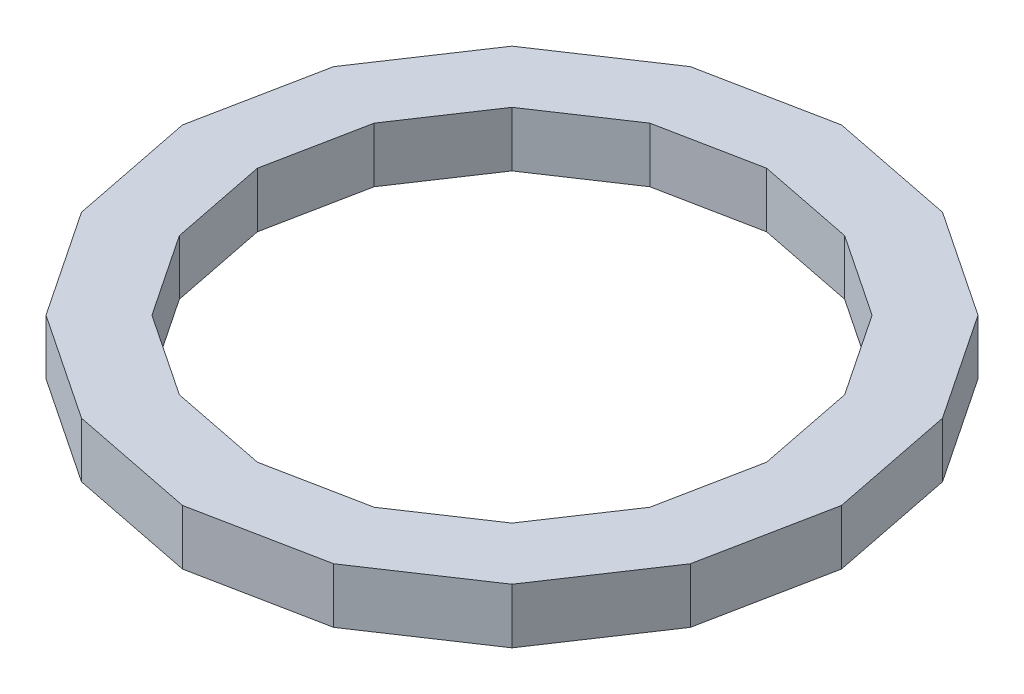
ISO-10303-21;
HEADER;
FILE_DESCRIPTION(('STEP AP214'),'2;1');
FILE_NAME('part.step','',(''),(''),'','','');
FILE_SCHEMA(('AUTOMOTIVE_DESIGN { 1 0 10303 214 1 1 1 1 }'));
ENDSEC;
DATA;
#1=APPLICATION_CONTEXT('core data for automotive mechanical design processes');
#2=APPLICATION_PROTOCOL_DEFINITION('international standard','automotive_design',2000,#1);
#3=PRODUCT_CONTEXT('',#1,'mechanical');
#4=PRODUCT('Part','Part','',(#3));
#5=PRODUCT_RELATED_PRODUCT_CATEGORY('part','',(#4));
#6=PRODUCT_DEFINITION_FORMATION('','',#4);
#7=PRODUCT_DEFINITION_CONTEXT('part definition',#1,'design');
#8=PRODUCT_DEFINITION('design','',#6,#7);
#9=PRODUCT_DEFINITION_SHAPE('','',#8);
#10=(LENGTH_UNIT() NAMED_UNIT(*) SI_UNIT(.MILLI.,.METRE.));
#11=(NAMED_UNIT(*) PLANE_ANGLE_UNIT() SI_UNIT($,.RADIAN.));
#12=(NAMED_UNIT(*) SI_UNIT($,.STERADIAN.) SOLID_ANGLE_UNIT());
#13=UNCERTAINTY_MEASURE_WITH_UNIT(LENGTH_MEASURE(1.E-05),#10,'distance_accuracy_value','');
#14=(GEOMETRIC_REPRESENTATION_CONTEXT(3) GLOBAL_UNCERTAINTY_ASSIGNED_CONTEXT((#13)) GLOBAL_UNIT_ASSIGNED_CONTEXT((#10,
#11,#12)) REPRESENTATION_CONTEXT('',''));
#15=CARTESIAN_POINT('',(0.,0.,0.));
#16=DIRECTION('',(0.,0.,1.));
#17=DIRECTION('',(1.,0.,0.));
#18=AXIS2_PLACEMENT_3D('',#15,#16,#17);
#19=CARTESIAN_POINT('',(0.,19.05,0.));
#20=DIRECTION('',(0.,1.,0.));
#21=DIRECTION('',(0.,0.,1.));
#22=AXIS2_PLACEMENT_3D('',#19,#20,#21);
#23=PLANE('',#22);
#24=DIRECTION('',(0.195090322016116,0.,-0.980785280403233));
#25=VECTOR('',#24,1.);
#26=CARTESIAN_POINT('',(105.249826838494,19.05,43.5959057139223));
#27=LINE('',#26,#25);
#28=CARTESIAN_POINT('',(105.249826838494,19.05,43.5959057139223));
#29=VERTEX_POINT('',#28);
#30=CARTESIAN_POINT('',(113.92159165211,19.05,-1.38083731866745E-12));
#31=VERTEX_POINT('',#30);
#32=EDGE_CURVE('E372',#29,#31,#27,.T.);
#33=ORIENTED_EDGE('',*,*,#32,.T.);
#34=DIRECTION('',(-0.19509032201614,0.,-0.980785280403228));
#35=VECTOR('',#34,1.);
#36=CARTESIAN_POINT('',(113.92159165211,19.05,-1.38083731866745E-12));
#37=LINE('',#36,#35);
#38=CARTESIAN_POINT('',(105.249826838493,19.05,-43.5959057139249));
#39=VERTEX_POINT('',#38);
#40=EDGE_CURVE('E375',#31,#39,#37,.T.);
#41=ORIENTED_EDGE('',*,*,#40,.T.);
#42=DIRECTION('',(-0.555570233019612,0.,-0.831469612302539));
#43=VECTOR('',#42,1.);
#44=CARTESIAN_POINT('',(105.249826838493,19.05,-43.5959057139249));
#45=LINE('',#44,#43);
#46=CARTESIAN_POINT('',(80.5547299807708,19.05,-80.5547299807727));
#47=VERTEX_POINT('',#46);
#48=EDGE_CURVE('E378',#39,#47,#45,.T.);
#49=ORIENTED_EDGE('',*,*,#48,.T.);
#50=DIRECTION('',(-0.831469612302552,0.,-0.555570233019592));
#51=VECTOR('',#50,1.);
#52=CARTESIAN_POINT('',(80.5547299807708,19.05,-80.5547299807727));
#53=LINE('',#52,#51);
#54=CARTESIAN_POINT('',(43.5959057139224,19.05,-105.249826838494));
#55=VERTEX_POINT('',#54);
#56=EDGE_CURVE('E380',#47,#55,#53,.T.);
#57=ORIENTED_EDGE('',*,*,#56,.T.);
#58=DIRECTION('',(-0.980785280403233,0.,-0.195090322016116));
#59=VECTOR('',#58,1.);
#60=CARTESIAN_POINT('',(43.5959057139224,19.05,-105.249826838494));
#61=LINE('',#60,#59);
#62=CARTESIAN_POINT('',(-1.36013104406031E-12,19.05,-113.92159165211));
#63=VERTEX_POINT('',#62);
#64=EDGE_CURVE('E382',#55,#63,#61,.T.);
#65=ORIENTED_EDGE('',*,*,#64,.T.);
#66=DIRECTION('',(-0.980785280403228,0.,0.19509032201614));
#67=VECTOR('',#66,1.);
#68=CARTESIAN_POINT('',(-1.36013104406031E-12,19.05,-113.92159165211));
#69=LINE('',#68,#67);
#70=CARTESIAN_POINT('',(-43.5959057139248,19.05,-105.249826838493));
#71=VERTEX_POINT('',#70);
#72=EDGE_CURVE('E384',#63,#71,#69,.T.);
#73=ORIENTED_EDGE('',*,*,#72,.T.);
#74=DIRECTION('',(-0.831469612302539,0.,0.555570233019612));
#75=VECTOR('',#74,1.);
#76=CARTESIAN_POINT('',(-43.5959057139248,19.05,-105.249826838493));
#77=LINE('',#76,#75);
#78=CARTESIAN_POINT('',(-80.5547299807727,19.05,-80.5547299807707));
#79=VERTEX_POINT('',#78);
#80=EDGE_CURVE('E387',#71,#79,#77,.T.);
#81=ORIENTED_EDGE('',*,*,#80,.T.);
#82=DIRECTION('',(-0.555570233019592,0.,0.831469612302552));
#83=VECTOR('',#82,1.);
#84=CARTESIAN_POINT('',(-80.5547299807727,19.05,-80.5547299807707));
#85=LINE('',#84,#83);
#86=CARTESIAN_POINT('',(-105.249826838494,19.05,-43.5959057139223));
#87=VERTEX_POINT('',#86);
#88=EDGE_CURVE('E390',#79,#87,#85,.T.);
#89=ORIENTED_EDGE('',*,*,#88,.T.);
#90=DIRECTION('',(-0.195090322016116,0.,0.980785280403233));
#91=VECTOR('',#90,1.);
#92=CARTESIAN_POINT('',(-105.249826838494,19.05,-43.5959057139223));
#93=LINE('',#92,#91);
#94=CARTESIAN_POINT('',(-113.92159165211,19.05,1.41129865460609E-12));
#95=VERTEX_POINT('',#94);
#96=EDGE_CURVE('E393',#87,#95,#93,.T.);
#97=ORIENTED_EDGE('',*,*,#96,.T.);
#98=DIRECTION('',(0.19509032201614,0.,0.980785280403228));
#99=VECTOR('',#98,1.);
#100=CARTESIAN_POINT('',(-113.92159165211,19.05,1.41129865460609E-12));
#101=LINE('',#100,#99);
#102=CARTESIAN_POINT('',(-105.249826838493,19.05,43.5959057139248));
#103=VERTEX_POINT('',#102);
#104=EDGE_CURVE('E395',#95,#103,#101,.T.);
#105=ORIENTED_EDGE('',*,*,#104,.T.);
#106=DIRECTION('',(0.555570233019612,0.,0.831469612302539));
#107=VECTOR('',#106,1.);
#108=CARTESIAN_POINT('',(-105.249826838493,19.05,43.5959057139248));
#109=LINE('',#108,#107);
#110=CARTESIAN_POINT('',(-80.5547299807708,19.05,80.5547299807727));
#111=VERTEX_POINT('',#110);
#112=EDGE_CURVE('E397',#103,#111,#109,.T.);
#113=ORIENTED_EDGE('',*,*,#112,.T.);
#114=DIRECTION('',(0.831469612302552,0.,0.555570233019592));
#115=VECTOR('',#114,1.);
#116=CARTESIAN_POINT('',(-80.5547299807708,19.05,80.5547299807727));
#117=LINE('',#116,#115);
#118=CARTESIAN_POINT('',(-43.5959057139223,19.05,105.249826838494));
#119=VERTEX_POINT('',#118);
#120=EDGE_CURVE('E400',#111,#119,#117,.T.);
#121=ORIENTED_EDGE('',*,*,#120,.T.);
#122=DIRECTION('',(0.980785280403233,0.,0.195090322016117));
#123=VECTOR('',#122,1.);
#124=CARTESIAN_POINT('',(-43.5959057139223,19.05,105.249826838494));
#125=LINE('',#124,#123);
#126=CARTESIAN_POINT('',(1.33304293934203E-12,19.05,113.92159165211));
#127=VERTEX_POINT('',#126);
#128=EDGE_CURVE('E403',#119,#127,#125,.T.);
#129=ORIENTED_EDGE('',*,*,#128,.T.);
#130=DIRECTION('',(0.980785280403228,0.,-0.19509032201614));
#131=VECTOR('',#130,1.);
#132=CARTESIAN_POINT('',(1.33304293934203E-12,19.05,113.92159165211));
#133=LINE('',#132,#131);
#134=CARTESIAN_POINT('',(43.5959057139249,19.05,105.249826838493));
#135=VERTEX_POINT('',#134);
#136=EDGE_CURVE('E405',#127,#135,#133,.T.);
#137=ORIENTED_EDGE('',*,*,#136,.T.);
#138=DIRECTION('',(0.831469612302538,0.,-0.555570233019612));
#139=VECTOR('',#138,1.);
#140=CARTESIAN_POINT('',(43.5959057139249,19.05,105.249826838493));
#141=LINE('',#140,#139);
#142=CARTESIAN_POINT('',(80.5547299807727,19.05,80.5547299807708));
#143=VERTEX_POINT('',#142);
#144=EDGE_CURVE('E408',#135,#143,#141,.T.);
#145=ORIENTED_EDGE('',*,*,#144,.T.);
#146=DIRECTION('',(0.555570233019593,0.,-0.831469612302552));
#147=VECTOR('',#146,1.);
#148=CARTESIAN_POINT('',(80.5547299807727,19.05,80.5547299807708));
#149=LINE('',#148,#147);
#150=EDGE_CURVE('E411',#143,#29,#149,.T.);
#151=ORIENTED_EDGE('',*,*,#150,.T.);
#152=EDGE_LOOP('',(#33,#41,#49,#57,#65,#73,#81,#89,#97,#105,#113,#121,#129,#137,#145,#151));
#153=FACE_BOUND('',#152,.T.);
#154=DIRECTION('',(-0.19509032201614,0.,-0.980785280403228));
#155=VECTOR('',#154,1.);
#156=CARTESIAN_POINT('',(88.0239762336187,19.05,-1.06343948983801E-12));
#157=LINE('',#156,#155);
#158=CARTESIAN_POINT('',(88.0239762336187,19.05,-1.06343948983801E-12));
#159=VERTEX_POINT('',#158);
#160=CARTESIAN_POINT('',(81.3235500124998,19.05,-33.6853173555053));
#161=VERTEX_POINT('',#160);
#162=EDGE_CURVE('E253',#159,#161,#157,.T.);
#163=ORIENTED_EDGE('',*,*,#162,.F.);
#164=DIRECTION('',(0.195090322016116,0.,-0.980785280403233));
#165=VECTOR('',#164,1.);
#166=CARTESIAN_POINT('',(81.3235500125007,19.05,33.6853173555033));
#167=LINE('',#166,#165);
#168=CARTESIAN_POINT('',(81.3235500125007,19.05,33.6853173555033));
#169=VERTEX_POINT('',#168);
#170=EDGE_CURVE('E244',#169,#159,#167,.T.);
#171=ORIENTED_EDGE('',*,*,#170,.F.);
#172=DIRECTION('',(0.555570233019592,0.,-0.831469612302552));
#173=VECTOR('',#172,1.);
#174=CARTESIAN_POINT('',(62.242350501796,19.05,62.2423505017945));
#175=LINE('',#174,#173);
#176=CARTESIAN_POINT('',(62.242350501796,19.05,62.2423505017945));
#177=VERTEX_POINT('',#176);
#178=EDGE_CURVE('E296',#177,#169,#175,.T.);
#179=ORIENTED_EDGE('',*,*,#178,.F.);
#180=DIRECTION('',(0.831469612302539,0.,-0.555570233019612));
#181=VECTOR('',#180,1.);
#182=CARTESIAN_POINT('',(33.6853173555052,19.05,81.3235500124999));
#183=LINE('',#182,#181);
#184=CARTESIAN_POINT('',(33.6853173555052,19.05,81.3235500124999));
#185=VERTEX_POINT('',#184);
#186=EDGE_CURVE('E294',#185,#177,#183,.T.);
#187=ORIENTED_EDGE('',*,*,#186,.F.);
#188=DIRECTION('',(0.980785280403228,0.,-0.19509032201614));
#189=VECTOR('',#188,1.);
#190=CARTESIAN_POINT('',(1.0448402771011E-12,19.05,88.0239762336187));
#191=LINE('',#190,#189);
#192=CARTESIAN_POINT('',(1.0448402771011E-12,19.05,88.0239762336187));
#193=VERTEX_POINT('',#192);
#194=EDGE_CURVE('E292',#193,#185,#191,.T.);
#195=ORIENTED_EDGE('',*,*,#194,.F.);
#196=DIRECTION('',(0.980785280403233,0.,0.195090322016116));
#197=VECTOR('',#196,1.);
#198=CARTESIAN_POINT('',(-33.6853173555033,19.05,81.3235500125007));
#199=LINE('',#198,#197);
#200=CARTESIAN_POINT('',(-33.6853173555033,19.05,81.3235500125007));
#201=VERTEX_POINT('',#200);
#202=EDGE_CURVE('E290',#201,#193,#199,.T.);
#203=ORIENTED_EDGE('',*,*,#202,.F.);
#204=DIRECTION('',(0.831469612302552,0.,0.555570233019592));
#205=VECTOR('',#204,1.);
#206=CARTESIAN_POINT('',(-62.2423505017945,19.05,62.242350501796));
#207=LINE('',#206,#205);
#208=CARTESIAN_POINT('',(-62.2423505017945,19.05,62.242350501796));
#209=VERTEX_POINT('',#208);
#210=EDGE_CURVE('E288',#209,#201,#207,.T.);
#211=ORIENTED_EDGE('',*,*,#210,.F.);
#212=DIRECTION('',(0.555570233019612,0.,0.831469612302539));
#213=VECTOR('',#212,1.);
#214=CARTESIAN_POINT('',(-81.3235500124998,19.05,33.6853173555053));
#215=LINE('',#214,#213);
#216=CARTESIAN_POINT('',(-81.3235500124998,19.05,33.6853173555053));
#217=VERTEX_POINT('',#216);
#218=EDGE_CURVE('E286',#217,#209,#215,.T.);
#219=ORIENTED_EDGE('',*,*,#218,.F.);
#220=DIRECTION('',(0.19509032201614,0.,0.980785280403228));
#221=VECTOR('',#220,1.);
#222=CARTESIAN_POINT('',(-88.0239762336187,19.05,1.07303064571338E-12));
#223=LINE('',#222,#221);
#224=CARTESIAN_POINT('',(-88.0239762336187,19.05,1.07303064571338E-12));
#225=VERTEX_POINT('',#224);
#226=EDGE_CURVE('E284',#225,#217,#223,.T.);
#227=ORIENTED_EDGE('',*,*,#226,.F.);
#228=DIRECTION('',(-0.195090322016116,0.,0.980785280403233));
#229=VECTOR('',#228,1.);
#230=CARTESIAN_POINT('',(-81.3235500125006,19.05,-33.6853173555033));
#231=LINE('',#230,#229);
#232=CARTESIAN_POINT('',(-81.3235500125006,19.05,-33.6853173555033));
#233=VERTEX_POINT('',#232);
#234=EDGE_CURVE('E281',#233,#225,#231,.T.);
#235=ORIENTED_EDGE('',*,*,#234,.F.);
#236=DIRECTION('',(-0.555570233019592,0.,0.831469612302552));
#237=VECTOR('',#236,1.);
#238=CARTESIAN_POINT('',(-62.242350501796,19.05,-62.2423505017945));
#239=LINE('',#238,#237);
#240=CARTESIAN_POINT('',(-62.242350501796,19.05,-62.2423505017945));
#241=VERTEX_POINT('',#240);
#242=EDGE_CURVE('E278',#241,#233,#239,.T.);
#243=ORIENTED_EDGE('',*,*,#242,.F.);
#244=DIRECTION('',(-0.831469612302538,0.,0.555570233019613));
#245=VECTOR('',#244,1.);
#246=CARTESIAN_POINT('',(-33.6853173555052,19.05,-81.3235500124998));
#247=LINE('',#246,#245);
#248=CARTESIAN_POINT('',(-33.6853173555052,19.05,-81.3235500124998));
#249=VERTEX_POINT('',#248);
#250=EDGE_CURVE('E276',#249,#241,#247,.T.);
#251=ORIENTED_EDGE('',*,*,#250,.F.);
#252=DIRECTION('',(-0.980785280403228,0.,0.19509032201614));
#253=VECTOR('',#252,1.);
#254=CARTESIAN_POINT('',(-1.08740701657072E-12,19.05,-88.0239762336187));
#255=LINE('',#254,#253);
#256=CARTESIAN_POINT('',(-1.08740701657072E-12,19.05,-88.0239762336187));
#257=VERTEX_POINT('',#256);
#258=EDGE_CURVE('E274',#257,#249,#255,.T.);
#259=ORIENTED_EDGE('',*,*,#258,.F.);
#260=DIRECTION('',(-0.980785280403233,0.,-0.195090322016116));
#261=VECTOR('',#260,1.);
#262=CARTESIAN_POINT('',(33.6853173555034,19.05,-81.3235500125006));
#263=LINE('',#262,#261);
#264=CARTESIAN_POINT('',(33.6853173555034,19.05,-81.3235500125006));
#265=VERTEX_POINT('',#264);
#266=EDGE_CURVE('E272',#265,#257,#263,.T.);
#267=ORIENTED_EDGE('',*,*,#266,.F.);
#268=DIRECTION('',(-0.831469612302552,0.,-0.555570233019592));
#269=VECTOR('',#268,1.);
#270=CARTESIAN_POINT('',(62.2423505017945,19.05,-62.2423505017961));
#271=LINE('',#270,#269);
#272=CARTESIAN_POINT('',(62.2423505017945,19.05,-62.2423505017961));
#273=VERTEX_POINT('',#272);
#274=EDGE_CURVE('E268',#273,#265,#271,.T.);
#275=ORIENTED_EDGE('',*,*,#274,.F.);
#276=DIRECTION('',(-0.555570233019612,0.,-0.831469612302539));
#277=VECTOR('',#276,1.);
#278=CARTESIAN_POINT('',(81.3235500124998,19.05,-33.6853173555053));
#279=LINE('',#278,#277);
#280=EDGE_CURVE('E266',#161,#273,#279,.T.);
#281=ORIENTED_EDGE('',*,*,#280,.F.);
#282=EDGE_LOOP('',(#163,#171,#179,#187,#195,#203,#211,#219,#227,#235,#243,#251,#259,#267,#275,#281));
#283=FACE_BOUND('',#282,.T.);
#284=ADVANCED_FACE('F35',(#153,#283),#23,.T.);
#285=CARTESIAN_POINT('',(0.,0.,0.));
#286=DIRECTION('',(0.,1.,0.));
#287=DIRECTION('',(0.,0.,1.));
#288=AXIS2_PLACEMENT_3D('',#285,#286,#287);
#289=PLANE('',#288);
#290=DIRECTION('',(0.195090322016116,0.,-0.980785280403233));
#291=VECTOR('',#290,1.);
#292=CARTESIAN_POINT('',(105.249826838494,0.,43.5959057139223));
#293=LINE('',#292,#291);
#294=CARTESIAN_POINT('',(105.249826838494,0.,43.5959057139223));
#295=VERTEX_POINT('',#294);
#296=CARTESIAN_POINT('',(113.92159165211,0.,-1.38083731866745E-12));
#297=VERTEX_POINT('',#296);
#298=EDGE_CURVE('E261',#295,#297,#293,.T.);
#299=ORIENTED_EDGE('',*,*,#298,.F.);
#300=DIRECTION('',(0.555570233019593,0.,-0.831469612302552));
#301=VECTOR('',#300,1.);
#302=CARTESIAN_POINT('',(80.5547299807727,0.,80.5547299807708));
#303=LINE('',#302,#301);
#304=CARTESIAN_POINT('',(80.5547299807727,0.,80.5547299807708));
#305=VERTEX_POINT('',#304);
#306=EDGE_CURVE('E376',#305,#295,#303,.T.);
#307=ORIENTED_EDGE('',*,*,#306,.F.);
#308=DIRECTION('',(0.831469612302538,0.,-0.555570233019612));
#309=VECTOR('',#308,1.);
#310=CARTESIAN_POINT('',(43.5959057139249,0.,105.249826838493));
#311=LINE('',#310,#309);
#312=CARTESIAN_POINT('',(43.5959057139249,0.,105.249826838493));
#313=VERTEX_POINT('',#312);
#314=EDGE_CURVE('E446',#313,#305,#311,.T.);
#315=ORIENTED_EDGE('',*,*,#314,.F.);
#316=DIRECTION('',(0.980785280403228,0.,-0.19509032201614));
#317=VECTOR('',#316,1.);
#318=CARTESIAN_POINT('',(1.33304293934203E-12,0.,113.92159165211));
#319=LINE('',#318,#317);
#320=CARTESIAN_POINT('',(1.33304293934203E-12,0.,113.92159165211));
#321=VERTEX_POINT('',#320);
#322=EDGE_CURVE('E443',#321,#313,#319,.T.);
#323=ORIENTED_EDGE('',*,*,#322,.F.);
#324=DIRECTION('',(0.980785280403233,0.,0.195090322016117));
#325=VECTOR('',#324,1.);
#326=CARTESIAN_POINT('',(-43.5959057139223,0.,105.249826838494));
#327=LINE('',#326,#325);
#328=CARTESIAN_POINT('',(-43.5959057139223,0.,105.249826838494));
#329=VERTEX_POINT('',#328);
#330=EDGE_CURVE('E440',#329,#321,#327,.T.);
#331=ORIENTED_EDGE('',*,*,#330,.F.);
#332=DIRECTION('',(0.831469612302552,0.,0.555570233019592));
#333=VECTOR('',#332,1.);
#334=CARTESIAN_POINT('',(-80.5547299807708,0.,80.5547299807727));
#335=LINE('',#334,#333);
#336=CARTESIAN_POINT('',(-80.5547299807708,0.,80.5547299807727));
#337=VERTEX_POINT('',#336);
#338=EDGE_CURVE('E437',#337,#329,#335,.T.);
#339=ORIENTED_EDGE('',*,*,#338,.F.);
#340=DIRECTION('',(0.555570233019612,0.,0.831469612302539));
#341=VECTOR('',#340,1.);
#342=CARTESIAN_POINT('',(-105.249826838493,0.,43.5959057139248));
#343=LINE('',#342,#341);
#344=CARTESIAN_POINT('',(-105.249826838493,0.,43.5959057139248));
#345=VERTEX_POINT('',#344);
#346=EDGE_CURVE('E435',#345,#337,#343,.T.);
#347=ORIENTED_EDGE('',*,*,#346,.F.);
#348=DIRECTION('',(0.19509032201614,0.,0.980785280403228));
#349=VECTOR('',#348,1.);
#350=CARTESIAN_POINT('',(-113.92159165211,0.,1.41129865460609E-12));
#351=LINE('',#350,#349);
#352=CARTESIAN_POINT('',(-113.92159165211,0.,1.41129865460609E-12));
#353=VERTEX_POINT('',#352);
#354=EDGE_CURVE('E432',#353,#345,#351,.T.);
#355=ORIENTED_EDGE('',*,*,#354,.F.);
#356=DIRECTION('',(-0.195090322016116,0.,0.980785280403233));
#357=VECTOR('',#356,1.);
#358=CARTESIAN_POINT('',(-105.249826838494,0.,-43.5959057139223));
#359=LINE('',#358,#357);
#360=CARTESIAN_POINT('',(-105.249826838494,0.,-43.5959057139223));
#361=VERTEX_POINT('',#360);
#362=EDGE_CURVE('E430',#361,#353,#359,.T.);
#363=ORIENTED_EDGE('',*,*,#362,.F.);
#364=DIRECTION('',(-0.555570233019592,0.,0.831469612302552));
#365=VECTOR('',#364,1.);
#366=CARTESIAN_POINT('',(-80.5547299807727,0.,-80.5547299807707));
#367=LINE('',#366,#365);
#368=CARTESIAN_POINT('',(-80.5547299807727,0.,-80.5547299807707));
#369=VERTEX_POINT('',#368);
#370=EDGE_CURVE('E428',#369,#361,#367,.T.);
#371=ORIENTED_EDGE('',*,*,#370,.F.);
#372=DIRECTION('',(-0.831469612302539,0.,0.555570233019612));
#373=VECTOR('',#372,1.);
#374=CARTESIAN_POINT('',(-43.5959057139248,0.,-105.249826838493));
#375=LINE('',#374,#373);
#376=CARTESIAN_POINT('',(-43.5959057139248,0.,-105.249826838493));
#377=VERTEX_POINT('',#376);
#378=EDGE_CURVE('E426',#377,#369,#375,.T.);
#379=ORIENTED_EDGE('',*,*,#378,.F.);
#380=DIRECTION('',(-0.980785280403228,0.,0.19509032201614));
#381=VECTOR('',#380,1.);
#382=CARTESIAN_POINT('',(-1.36013104406031E-12,0.,-113.92159165211));
#383=LINE('',#382,#381);
#384=CARTESIAN_POINT('',(-1.36013104406031E-12,0.,-113.92159165211));
#385=VERTEX_POINT('',#384);
#386=EDGE_CURVE('E424',#385,#377,#383,.T.);
#387=ORIENTED_EDGE('',*,*,#386,.F.);
#388=DIRECTION('',(-0.980785280403233,0.,-0.195090322016116));
#389=VECTOR('',#388,1.);
#390=CARTESIAN_POINT('',(43.5959057139224,0.,-105.249826838494));
#391=LINE('',#390,#389);
#392=CARTESIAN_POINT('',(43.5959057139224,0.,-105.249826838494));
#393=VERTEX_POINT('',#392);
#394=EDGE_CURVE('E422',#393,#385,#391,.T.);
#395=ORIENTED_EDGE('',*,*,#394,.F.);
#396=DIRECTION('',(-0.831469612302552,0.,-0.555570233019592));
#397=VECTOR('',#396,1.);
#398=CARTESIAN_POINT('',(80.5547299807708,0.,-80.5547299807727));
#399=LINE('',#398,#397);
#400=CARTESIAN_POINT('',(80.5547299807708,0.,-80.5547299807727));
#401=VERTEX_POINT('',#400);
#402=EDGE_CURVE('E420',#401,#393,#399,.T.);
#403=ORIENTED_EDGE('',*,*,#402,.F.);
#404=DIRECTION('',(-0.555570233019612,0.,-0.831469612302539));
#405=VECTOR('',#404,1.);
#406=CARTESIAN_POINT('',(105.249826838493,0.,-43.5959057139249));
#407=LINE('',#406,#405);
#408=CARTESIAN_POINT('',(105.249826838493,0.,-43.5959057139249));
#409=VERTEX_POINT('',#408);
#410=EDGE_CURVE('E418',#409,#401,#407,.T.);
#411=ORIENTED_EDGE('',*,*,#410,.F.);
#412=DIRECTION('',(-0.19509032201614,0.,-0.980785280403228));
#413=VECTOR('',#412,1.);
#414=CARTESIAN_POINT('',(113.92159165211,0.,-1.38083731866745E-12));
#415=LINE('',#414,#413);
#416=EDGE_CURVE('E416',#297,#409,#415,.T.);
#417=ORIENTED_EDGE('',*,*,#416,.F.);
#418=EDGE_LOOP('',(#299,#307,#315,#323,#331,#339,#347,#355,#363,#371,#379,#387,#395,#403,#411,#417));
#419=FACE_BOUND('',#418,.T.);
#420=DIRECTION('',(0.195090322016116,0.,-0.980785280403233));
#421=VECTOR('',#420,1.);
#422=CARTESIAN_POINT('',(81.3235500125007,0.,33.6853173555033));
#423=LINE('',#422,#421);
#424=CARTESIAN_POINT('',(81.3235500125007,0.,33.6853173555033));
#425=VERTEX_POINT('',#424);
#426=CARTESIAN_POINT('',(88.0239762336187,0.,-1.06343948983801E-12));
#427=VERTEX_POINT('',#426);
#428=EDGE_CURVE('E58',#425,#427,#423,.T.);
#429=ORIENTED_EDGE('',*,*,#428,.T.);
#430=DIRECTION('',(-0.19509032201614,0.,-0.980785280403228));
#431=VECTOR('',#430,1.);
#432=CARTESIAN_POINT('',(88.0239762336187,0.,-1.06343948983801E-12));
#433=LINE('',#432,#431);
#434=CARTESIAN_POINT('',(81.3235500124998,0.,-33.6853173555053));
#435=VERTEX_POINT('',#434);
#436=EDGE_CURVE('E260',#427,#435,#433,.T.);
#437=ORIENTED_EDGE('',*,*,#436,.T.);
#438=DIRECTION('',(-0.555570233019612,0.,-0.831469612302539));
#439=VECTOR('',#438,1.);
#440=CARTESIAN_POINT('',(81.3235500124998,0.,-33.6853173555053));
#441=LINE('',#440,#439);
#442=CARTESIAN_POINT('',(62.2423505017945,0.,-62.2423505017961));
#443=VERTEX_POINT('',#442);
#444=EDGE_CURVE('E300',#435,#443,#441,.T.);
#445=ORIENTED_EDGE('',*,*,#444,.T.);
#446=DIRECTION('',(-0.831469612302552,0.,-0.555570233019592));
#447=VECTOR('',#446,1.);
#448=CARTESIAN_POINT('',(62.2423505017945,0.,-62.2423505017961));
#449=LINE('',#448,#447);
#450=CARTESIAN_POINT('',(33.6853173555034,0.,-81.3235500125006));
#451=VERTEX_POINT('',#450);
#452=EDGE_CURVE('E303',#443,#451,#449,.T.);
#453=ORIENTED_EDGE('',*,*,#452,.T.);
#454=DIRECTION('',(-0.980785280403233,0.,-0.195090322016116));
#455=VECTOR('',#454,1.);
#456=CARTESIAN_POINT('',(33.6853173555034,0.,-81.3235500125006));
#457=LINE('',#456,#455);
#458=CARTESIAN_POINT('',(-1.08740701657072E-12,0.,-88.0239762336187));
#459=VERTEX_POINT('',#458);
#460=EDGE_CURVE('E306',#451,#459,#457,.T.);
#461=ORIENTED_EDGE('',*,*,#460,.T.);
#462=DIRECTION('',(-0.980785280403228,0.,0.19509032201614));
#463=VECTOR('',#462,1.);
#464=CARTESIAN_POINT('',(-1.08740701657072E-12,0.,-88.0239762336187));
#465=LINE('',#464,#463);
#466=CARTESIAN_POINT('',(-33.6853173555052,0.,-81.3235500124998));
#467=VERTEX_POINT('',#466);
#468=EDGE_CURVE('E309',#459,#467,#465,.T.);
#469=ORIENTED_EDGE('',*,*,#468,.T.);
#470=DIRECTION('',(-0.831469612302538,0.,0.555570233019613));
#471=VECTOR('',#470,1.);
#472=CARTESIAN_POINT('',(-33.6853173555052,0.,-81.3235500124998));
#473=LINE('',#472,#471);
#474=CARTESIAN_POINT('',(-62.242350501796,0.,-62.2423505017945));
#475=VERTEX_POINT('',#474);
#476=EDGE_CURVE('E312',#467,#475,#473,.T.);
#477=ORIENTED_EDGE('',*,*,#476,.T.);
#478=DIRECTION('',(-0.555570233019592,0.,0.831469612302552));
#479=VECTOR('',#478,1.);
#480=CARTESIAN_POINT('',(-62.242350501796,0.,-62.2423505017945));
#481=LINE('',#480,#479);
#482=CARTESIAN_POINT('',(-81.3235500125006,0.,-33.6853173555033));
#483=VERTEX_POINT('',#482);
#484=EDGE_CURVE('E315',#475,#483,#481,.T.);
#485=ORIENTED_EDGE('',*,*,#484,.T.);
#486=DIRECTION('',(-0.195090322016116,0.,0.980785280403233));
#487=VECTOR('',#486,1.);
#488=CARTESIAN_POINT('',(-81.3235500125006,0.,-33.6853173555033));
#489=LINE('',#488,#487);
#490=CARTESIAN_POINT('',(-88.0239762336187,0.,1.07303064571338E-12));
#491=VERTEX_POINT('',#490);
#492=EDGE_CURVE('E318',#483,#491,#489,.T.);
#493=ORIENTED_EDGE('',*,*,#492,.T.);
#494=DIRECTION('',(0.19509032201614,0.,0.980785280403228));
#495=VECTOR('',#494,1.);
#496=CARTESIAN_POINT('',(-88.0239762336187,0.,1.07303064571338E-12));
#497=LINE('',#496,#495);
#498=CARTESIAN_POINT('',(-81.3235500124998,0.,33.6853173555053));
#499=VERTEX_POINT('',#498);
#500=EDGE_CURVE('E322',#491,#499,#497,.T.);
#501=ORIENTED_EDGE('',*,*,#500,.T.);
#502=DIRECTION('',(0.555570233019612,0.,0.831469612302539));
#503=VECTOR('',#502,1.);
#504=CARTESIAN_POINT('',(-81.3235500124998,0.,33.6853173555053));
#505=LINE('',#504,#503);
#506=CARTESIAN_POINT('',(-62.2423505017945,0.,62.242350501796));
#507=VERTEX_POINT('',#506);
#508=EDGE_CURVE('E325',#499,#507,#505,.T.);
#509=ORIENTED_EDGE('',*,*,#508,.T.);
#510=DIRECTION('',(0.831469612302552,0.,0.555570233019592));
#511=VECTOR('',#510,1.);
#512=CARTESIAN_POINT('',(-62.2423505017945,0.,62.242350501796));
#513=LINE('',#512,#511);
#514=CARTESIAN_POINT('',(-33.6853173555033,0.,81.3235500125007));
#515=VERTEX_POINT('',#514);
#516=EDGE_CURVE('E328',#507,#515,#513,.T.);
#517=ORIENTED_EDGE('',*,*,#516,.T.);
#518=DIRECTION('',(0.980785280403233,0.,0.195090322016116));
#519=VECTOR('',#518,1.);
#520=CARTESIAN_POINT('',(-33.6853173555033,0.,81.3235500125007));
#521=LINE('',#520,#519);
#522=CARTESIAN_POINT('',(1.0448402771011E-12,0.,88.0239762336187));
#523=VERTEX_POINT('',#522);
#524=EDGE_CURVE('E331',#515,#523,#521,.T.);
#525=ORIENTED_EDGE('',*,*,#524,.T.);
#526=DIRECTION('',(0.980785280403228,0.,-0.19509032201614));
#527=VECTOR('',#526,1.);
#528=CARTESIAN_POINT('',(1.0448402771011E-12,0.,88.0239762336187));
#529=LINE('',#528,#527);
#530=CARTESIAN_POINT('',(33.6853173555052,0.,81.3235500124999));
#531=VERTEX_POINT('',#530);
#532=EDGE_CURVE('E334',#523,#531,#529,.T.);
#533=ORIENTED_EDGE('',*,*,#532,.T.);
#534=DIRECTION('',(0.831469612302539,0.,-0.555570233019612));
#535=VECTOR('',#534,1.);
#536=CARTESIAN_POINT('',(33.6853173555052,0.,81.3235500124999));
#537=LINE('',#536,#535);
#538=CARTESIAN_POINT('',(62.242350501796,0.,62.2423505017945));
#539=VERTEX_POINT('',#538);
#540=EDGE_CURVE('E337',#531,#539,#537,.T.);
#541=ORIENTED_EDGE('',*,*,#540,.T.);
#542=DIRECTION('',(0.555570233019592,0.,-0.831469612302552));
#543=VECTOR('',#542,1.);
#544=CARTESIAN_POINT('',(62.242350501796,0.,62.2423505017945));
#545=LINE('',#544,#543);
#546=EDGE_CURVE('E254',#539,#425,#545,.T.);
#547=ORIENTED_EDGE('',*,*,#546,.T.);
#548=EDGE_LOOP('',(#429,#437,#445,#453,#461,#469,#477,#485,#493,#501,#509,#517,#525,#533,#541,#547));
#549=FACE_BOUND('',#548,.T.);
#550=ADVANCED_FACE('F502',(#419,#549),#289,.F.);
#551=CARTESIAN_POINT('',(105.249826838494,19.05,43.5959057139223));
#552=DIRECTION('',(-0.980785280403233,0.,-0.195090322016116));
#553=DIRECTION('',(-0.195090322016116,0.,0.980785280403233));
#554=AXIS2_PLACEMENT_3D('',#551,#552,#553);
#555=PLANE('',#554);
#556=ORIENTED_EDGE('',*,*,#298,.T.);
#557=DIRECTION('',(0.,-1.,0.));
#558=VECTOR('',#557,1.);
#559=CARTESIAN_POINT('',(113.92159165211,19.05,-1.38083731866745E-12));
#560=LINE('',#559,#558);
#561=EDGE_CURVE('E11',#31,#297,#560,.T.);
#562=ORIENTED_EDGE('',*,*,#561,.F.);
#563=ORIENTED_EDGE('',*,*,#32,.F.);
#564=DIRECTION('',(0.,-1.,0.));
#565=VECTOR('',#564,1.);
#566=CARTESIAN_POINT('',(105.249826838494,19.05,43.5959057139223));
#567=LINE('',#566,#565);
#568=EDGE_CURVE('E413',#29,#295,#567,.T.);
#569=ORIENTED_EDGE('',*,*,#568,.T.);
#570=EDGE_LOOP('',(#556,#562,#563,#569));
#571=FACE_BOUND('',#570,.T.);
#572=ADVANCED_FACE('F37',(#571),#555,.F.);
#573=CARTESIAN_POINT('',(113.92159165211,19.05,-1.38083731866745E-12));
#574=DIRECTION('',(-0.980785280403228,0.,0.19509032201614));
#575=DIRECTION('',(0.19509032201614,0.,0.980785280403228));
#576=AXIS2_PLACEMENT_3D('',#573,#574,#575);
#577=PLANE('',#576);
#578=ORIENTED_EDGE('',*,*,#416,.T.);
#579=DIRECTION('',(0.,-1.,0.));
#580=VECTOR('',#579,1.);
#581=CARTESIAN_POINT('',(105.249826838493,19.05,-43.5959057139249));
#582=LINE('',#581,#580);
#583=EDGE_CURVE('E43',#39,#409,#582,.T.);
#584=ORIENTED_EDGE('',*,*,#583,.F.);
#585=ORIENTED_EDGE('',*,*,#40,.F.);
#586=ORIENTED_EDGE('',*,*,#561,.T.);
#587=EDGE_LOOP('',(#578,#584,#585,#586));
#588=FACE_BOUND('',#587,.T.);
#589=ADVANCED_FACE('F519',(#588),#577,.F.);
#590=CARTESIAN_POINT('',(105.249826838493,19.05,-43.5959057139249));
#591=DIRECTION('',(-0.831469612302539,0.,0.555570233019612));
#592=DIRECTION('',(0.555570233019612,0.,0.831469612302539));
#593=AXIS2_PLACEMENT_3D('',#590,#591,#592);
#594=PLANE('',#593);
#595=ORIENTED_EDGE('',*,*,#410,.T.);
#596=DIRECTION('',(0.,-1.,0.));
#597=VECTOR('',#596,1.);
#598=CARTESIAN_POINT('',(80.5547299807708,19.05,-80.5547299807727));
#599=LINE('',#598,#597);
#600=EDGE_CURVE('E489',#47,#401,#599,.T.);
#601=ORIENTED_EDGE('',*,*,#600,.F.);
#602=ORIENTED_EDGE('',*,*,#48,.F.);
#603=ORIENTED_EDGE('',*,*,#583,.T.);
#604=EDGE_LOOP('',(#595,#601,#602,#603));
#605=FACE_BOUND('',#604,.T.);
#606=ADVANCED_FACE('F496',(#605),#594,.F.);
#607=CARTESIAN_POINT('',(80.5547299807708,19.05,-80.5547299807727));
#608=DIRECTION('',(-0.555570233019592,0.,0.831469612302552));
#609=DIRECTION('',(0.831469612302552,0.,0.555570233019592));
#610=AXIS2_PLACEMENT_3D('',#607,#608,#609);
#611=PLANE('',#610);
#612=ORIENTED_EDGE('',*,*,#402,.T.);
#613=DIRECTION('',(0.,-1.,0.));
#614=VECTOR('',#613,1.);
#615=CARTESIAN_POINT('',(43.5959057139224,19.05,-105.249826838494));
#616=LINE('',#615,#614);
#617=EDGE_CURVE('E485',#55,#393,#616,.T.);
#618=ORIENTED_EDGE('',*,*,#617,.F.);
#619=ORIENTED_EDGE('',*,*,#56,.F.);
#620=ORIENTED_EDGE('',*,*,#600,.T.);
#621=EDGE_LOOP('',(#612,#618,#619,#620));
#622=FACE_BOUND('',#621,.T.);
#623=ADVANCED_FACE('F508',(#622),#611,.F.);
#624=CARTESIAN_POINT('',(43.5959057139224,19.05,-105.249826838494));
#625=DIRECTION('',(-0.195090322016116,0.,0.980785280403233));
#626=DIRECTION('',(0.980785280403233,0.,0.195090322016116));
#627=AXIS2_PLACEMENT_3D('',#624,#625,#626);
#628=PLANE('',#627);
#629=ORIENTED_EDGE('',*,*,#394,.T.);
#630=DIRECTION('',(0.,-1.,0.));
#631=VECTOR('',#630,1.);
#632=CARTESIAN_POINT('',(-1.36013104406031E-12,19.05,-113.92159165211));
#633=LINE('',#632,#631);
#634=EDGE_CURVE('E482',#63,#385,#633,.T.);
#635=ORIENTED_EDGE('',*,*,#634,.F.);
#636=ORIENTED_EDGE('',*,*,#64,.F.);
#637=ORIENTED_EDGE('',*,*,#617,.T.);
#638=EDGE_LOOP('',(#629,#635,#636,#637));
#639=FACE_BOUND('',#638,.T.);
#640=ADVANCED_FACE('F512',(#639),#628,.F.);
#641=CARTESIAN_POINT('',(-1.36013104406031E-12,19.05,-113.92159165211));
#642=DIRECTION('',(0.19509032201614,0.,0.980785280403228));
#643=DIRECTION('',(0.980785280403228,0.,-0.19509032201614));
#644=AXIS2_PLACEMENT_3D('',#641,#642,#643);
#645=PLANE('',#644);
#646=ORIENTED_EDGE('',*,*,#386,.T.);
#647=DIRECTION('',(0.,-1.,0.));
#648=VECTOR('',#647,1.);
#649=CARTESIAN_POINT('',(-43.5959057139248,19.05,-105.249826838493));
#650=LINE('',#649,#648);
#651=EDGE_CURVE('E479',#71,#377,#650,.T.);
#652=ORIENTED_EDGE('',*,*,#651,.F.);
#653=ORIENTED_EDGE('',*,*,#72,.F.);
#654=ORIENTED_EDGE('',*,*,#634,.T.);
#655=EDGE_LOOP('',(#646,#652,#653,#654));
#656=FACE_BOUND('',#655,.T.);
#657=ADVANCED_FACE('F572',(#656),#645,.F.);
#658=CARTESIAN_POINT('',(-43.5959057139248,19.05,-105.249826838493));
#659=DIRECTION('',(0.555570233019612,0.,0.831469612302539));
#660=DIRECTION('',(0.831469612302539,0.,-0.555570233019612));
#661=AXIS2_PLACEMENT_3D('',#658,#659,#660);
#662=PLANE('',#661);
#663=ORIENTED_EDGE('',*,*,#378,.T.);
#664=DIRECTION('',(0.,-1.,0.));
#665=VECTOR('',#664,1.);
#666=CARTESIAN_POINT('',(-80.5547299807727,19.05,-80.5547299807707));
#667=LINE('',#666,#665);
#668=EDGE_CURVE('E476',#79,#369,#667,.T.);
#669=ORIENTED_EDGE('',*,*,#668,.F.);
#670=ORIENTED_EDGE('',*,*,#80,.F.);
#671=ORIENTED_EDGE('',*,*,#651,.T.);
#672=EDGE_LOOP('',(#663,#669,#670,#671));
#673=FACE_BOUND('',#672,.T.);
#674=ADVANCED_FACE('F569',(#673),#662,.F.);
#675=CARTESIAN_POINT('',(-80.5547299807727,19.05,-80.5547299807707));
#676=DIRECTION('',(0.831469612302552,0.,0.555570233019592));
#677=DIRECTION('',(0.555570233019592,0.,-0.831469612302552));
#678=AXIS2_PLACEMENT_3D('',#675,#676,#677);
#679=PLANE('',#678);
#680=ORIENTED_EDGE('',*,*,#370,.T.);
#681=DIRECTION('',(0.,-1.,0.));
#682=VECTOR('',#681,1.);
#683=CARTESIAN_POINT('',(-105.249826838494,19.05,-43.5959057139223));
#684=LINE('',#683,#682);
#685=EDGE_CURVE('E473',#87,#361,#684,.T.);
#686=ORIENTED_EDGE('',*,*,#685,.F.);
#687=ORIENTED_EDGE('',*,*,#88,.F.);
#688=ORIENTED_EDGE('',*,*,#668,.T.);
#689=EDGE_LOOP('',(#680,#686,#687,#688));
#690=FACE_BOUND('',#689,.T.);
#691=ADVANCED_FACE('F565',(#690),#679,.F.);
#692=CARTESIAN_POINT('',(-105.249826838494,19.05,-43.5959057139223));
#693=DIRECTION('',(0.980785280403233,0.,0.195090322016116));
#694=DIRECTION('',(0.195090322016116,0.,-0.980785280403233));
#695=AXIS2_PLACEMENT_3D('',#692,#693,#694);
#696=PLANE('',#695);
#697=ORIENTED_EDGE('',*,*,#362,.T.);
#698=DIRECTION('',(0.,-1.,0.));
#699=VECTOR('',#698,1.);
#700=CARTESIAN_POINT('',(-113.92159165211,19.05,1.41129865460609E-12));
#701=LINE('',#700,#699);
#702=EDGE_CURVE('E470',#95,#353,#701,.T.);
#703=ORIENTED_EDGE('',*,*,#702,.F.);
#704=ORIENTED_EDGE('',*,*,#96,.F.);
#705=ORIENTED_EDGE('',*,*,#685,.T.);
#706=EDGE_LOOP('',(#697,#703,#704,#705));
#707=FACE_BOUND('',#706,.T.);
#708=ADVANCED_FACE('F561',(#707),#696,.F.);
#709=CARTESIAN_POINT('',(-113.92159165211,19.05,1.41129865460609E-12));
#710=DIRECTION('',(0.980785280403228,0.,-0.19509032201614));
#711=DIRECTION('',(-0.19509032201614,0.,-0.980785280403228));
#712=AXIS2_PLACEMENT_3D('',#709,#710,#711);
#713=PLANE('',#712);
#714=ORIENTED_EDGE('',*,*,#354,.T.);
#715=DIRECTION('',(0.,-1.,0.));
#716=VECTOR('',#715,1.);
#717=CARTESIAN_POINT('',(-105.249826838493,19.05,43.5959057139248));
#718=LINE('',#717,#716);
#719=EDGE_CURVE('E466',#103,#345,#718,.T.);
#720=ORIENTED_EDGE('',*,*,#719,.F.);
#721=ORIENTED_EDGE('',*,*,#104,.F.);
#722=ORIENTED_EDGE('',*,*,#702,.T.);
#723=EDGE_LOOP('',(#714,#720,#721,#722));
#724=FACE_BOUND('',#723,.T.);
#725=ADVANCED_FACE('F556',(#724),#713,.F.);
#726=CARTESIAN_POINT('',(-105.249826838493,19.05,43.5959057139248));
#727=DIRECTION('',(0.831469612302539,0.,-0.555570233019612));
#728=DIRECTION('',(-0.555570233019612,0.,-0.831469612302539));
#729=AXIS2_PLACEMENT_3D('',#726,#727,#728);
#730=PLANE('',#729);
#731=ORIENTED_EDGE('',*,*,#346,.T.);
#732=DIRECTION('',(0.,-1.,0.));
#733=VECTOR('',#732,1.);
#734=CARTESIAN_POINT('',(-80.5547299807708,19.05,80.5547299807727));
#735=LINE('',#734,#733);
#736=EDGE_CURVE('E463',#111,#337,#735,.T.);
#737=ORIENTED_EDGE('',*,*,#736,.F.);
#738=ORIENTED_EDGE('',*,*,#112,.F.);
#739=ORIENTED_EDGE('',*,*,#719,.T.);
#740=EDGE_LOOP('',(#731,#737,#738,#739));
#741=FACE_BOUND('',#740,.T.);
#742=ADVANCED_FACE('F550',(#741),#730,.F.);
#743=CARTESIAN_POINT('',(-80.5547299807708,19.05,80.5547299807727));
#744=DIRECTION('',(0.555570233019592,0.,-0.831469612302552));
#745=DIRECTION('',(-0.831469612302552,0.,-0.555570233019592));
#746=AXIS2_PLACEMENT_3D('',#743,#744,#745);
#747=PLANE('',#746);
#748=ORIENTED_EDGE('',*,*,#338,.T.);
#749=DIRECTION('',(0.,-1.,0.));
#750=VECTOR('',#749,1.);
#751=CARTESIAN_POINT('',(-43.5959057139223,19.05,105.249826838494));
#752=LINE('',#751,#750);
#753=EDGE_CURVE('E460',#119,#329,#752,.T.);
#754=ORIENTED_EDGE('',*,*,#753,.F.);
#755=ORIENTED_EDGE('',*,*,#120,.F.);
#756=ORIENTED_EDGE('',*,*,#736,.T.);
#757=EDGE_LOOP('',(#748,#754,#755,#756));
#758=FACE_BOUND('',#757,.T.);
#759=ADVANCED_FACE('F546',(#758),#747,.F.);
#760=CARTESIAN_POINT('',(-43.5959057139223,19.05,105.249826838494));
#761=DIRECTION('',(0.195090322016117,0.,-0.980785280403233));
#762=DIRECTION('',(-0.980785280403233,0.,-0.195090322016117));
#763=AXIS2_PLACEMENT_3D('',#760,#761,#762);
#764=PLANE('',#763);
#765=ORIENTED_EDGE('',*,*,#330,.T.);
#766=DIRECTION('',(0.,-1.,0.));
#767=VECTOR('',#766,1.);
#768=CARTESIAN_POINT('',(1.33304293934203E-12,19.05,113.92159165211));
#769=LINE('',#768,#767);
#770=EDGE_CURVE('E457',#127,#321,#769,.T.);
#771=ORIENTED_EDGE('',*,*,#770,.F.);
#772=ORIENTED_EDGE('',*,*,#128,.F.);
#773=ORIENTED_EDGE('',*,*,#753,.T.);
#774=EDGE_LOOP('',(#765,#771,#772,#773));
#775=FACE_BOUND('',#774,.T.);
#776=ADVANCED_FACE('F541',(#775),#764,.F.);
#777=CARTESIAN_POINT('',(1.33304293934203E-12,19.05,113.92159165211));
#778=DIRECTION('',(-0.19509032201614,0.,-0.980785280403228));
#779=DIRECTION('',(-0.980785280403228,0.,0.19509032201614));
#780=AXIS2_PLACEMENT_3D('',#777,#778,#779);
#781=PLANE('',#780);
#782=ORIENTED_EDGE('',*,*,#322,.T.);
#783=DIRECTION('',(0.,-1.,0.));
#784=VECTOR('',#783,1.);
#785=CARTESIAN_POINT('',(43.5959057139249,19.05,105.249826838493));
#786=LINE('',#785,#784);
#787=EDGE_CURVE('E454',#135,#313,#786,.T.);
#788=ORIENTED_EDGE('',*,*,#787,.F.);
#789=ORIENTED_EDGE('',*,*,#136,.F.);
#790=ORIENTED_EDGE('',*,*,#770,.T.);
#791=EDGE_LOOP('',(#782,#788,#789,#790));
#792=FACE_BOUND('',#791,.T.);
#793=ADVANCED_FACE('F535',(#792),#781,.F.);
#794=CARTESIAN_POINT('',(43.5959057139249,19.05,105.249826838493));
#795=DIRECTION('',(-0.555570233019612,0.,-0.831469612302538));
#796=DIRECTION('',(-0.831469612302539,0.,0.555570233019613));
#797=AXIS2_PLACEMENT_3D('',#794,#795,#796);
#798=PLANE('',#797);
#799=ORIENTED_EDGE('',*,*,#314,.T.);
#800=DIRECTION('',(0.,-1.,0.));
#801=VECTOR('',#800,1.);
#802=CARTESIAN_POINT('',(80.5547299807727,19.05,80.5547299807708));
#803=LINE('',#802,#801);
#804=EDGE_CURVE('E451',#143,#305,#803,.T.);
#805=ORIENTED_EDGE('',*,*,#804,.F.);
#806=ORIENTED_EDGE('',*,*,#144,.F.);
#807=ORIENTED_EDGE('',*,*,#787,.T.);
#808=EDGE_LOOP('',(#799,#805,#806,#807));
#809=FACE_BOUND('',#808,.T.);
#810=ADVANCED_FACE('F531',(#809),#798,.F.);
#811=CARTESIAN_POINT('',(80.5547299807727,19.05,80.5547299807708));
#812=DIRECTION('',(-0.831469612302552,0.,-0.555570233019593));
#813=DIRECTION('',(-0.555570233019593,0.,0.831469612302552));
#814=AXIS2_PLACEMENT_3D('',#811,#812,#813);
#815=PLANE('',#814);
#816=ORIENTED_EDGE('',*,*,#306,.T.);
#817=ORIENTED_EDGE('',*,*,#568,.F.);
#818=ORIENTED_EDGE('',*,*,#150,.F.);
#819=ORIENTED_EDGE('',*,*,#804,.T.);
#820=EDGE_LOOP('',(#816,#817,#818,#819));
#821=FACE_BOUND('',#820,.T.);
#822=ADVANCED_FACE('F526',(#821),#815,.F.);
#823=CARTESIAN_POINT('',(81.3235500125007,19.05,33.6853173555033));
#824=DIRECTION('',(-0.980785280403233,0.,-0.195090322016116));
#825=DIRECTION('',(-0.195090322016116,0.,0.980785280403233));
#826=AXIS2_PLACEMENT_3D('',#823,#824,#825);
#827=PLANE('',#826);
#828=ORIENTED_EDGE('',*,*,#428,.F.);
#829=DIRECTION('',(0.,-1.,0.));
#830=VECTOR('',#829,1.);
#831=CARTESIAN_POINT('',(81.3235500125007,19.05,33.6853173555033));
#832=LINE('',#831,#830);
#833=EDGE_CURVE('E248',#169,#425,#832,.T.);
#834=ORIENTED_EDGE('',*,*,#833,.F.);
#835=ORIENTED_EDGE('',*,*,#170,.T.);
#836=DIRECTION('',(0.,-1.,0.));
#837=VECTOR('',#836,1.);
#838=CARTESIAN_POINT('',(88.0239762336187,19.05,-1.06343948983801E-12));
#839=LINE('',#838,#837);
#840=EDGE_CURVE('E247',#159,#427,#839,.T.);
#841=ORIENTED_EDGE('',*,*,#840,.T.);
#842=EDGE_LOOP('',(#828,#834,#835,#841));
#843=FACE_BOUND('',#842,.T.);
#844=ADVANCED_FACE('F246',(#843),#827,.T.);
#845=CARTESIAN_POINT('',(88.0239762336187,19.05,-1.06343948983801E-12));
#846=DIRECTION('',(-0.980785280403228,0.,0.19509032201614));
#847=DIRECTION('',(0.19509032201614,0.,0.980785280403228));
#848=AXIS2_PLACEMENT_3D('',#845,#846,#847);
#849=PLANE('',#848);
#850=ORIENTED_EDGE('',*,*,#436,.F.);
#851=ORIENTED_EDGE('',*,*,#840,.F.);
#852=ORIENTED_EDGE('',*,*,#162,.T.);
#853=DIRECTION('',(0.,-1.,0.));
#854=VECTOR('',#853,1.);
#855=CARTESIAN_POINT('',(81.3235500124998,19.05,-33.6853173555053));
#856=LINE('',#855,#854);
#857=EDGE_CURVE('E262',#161,#435,#856,.T.);
#858=ORIENTED_EDGE('',*,*,#857,.T.);
#859=EDGE_LOOP('',(#850,#851,#852,#858));
#860=FACE_BOUND('',#859,.T.);
#861=ADVANCED_FACE('F257',(#860),#849,.T.);
#862=CARTESIAN_POINT('',(81.3235500124998,19.05,-33.6853173555053));
#863=DIRECTION('',(-0.831469612302538,0.,0.555570233019612));
#864=DIRECTION('',(0.555570233019612,0.,0.831469612302539));
#865=AXIS2_PLACEMENT_3D('',#862,#863,#864);
#866=PLANE('',#865);
#867=ORIENTED_EDGE('',*,*,#444,.F.);
#868=ORIENTED_EDGE('',*,*,#857,.F.);
#869=ORIENTED_EDGE('',*,*,#280,.T.);
#870=DIRECTION('',(0.,-1.,0.));
#871=VECTOR('',#870,1.);
#872=CARTESIAN_POINT('',(62.2423505017945,19.05,-62.2423505017961));
#873=LINE('',#872,#871);
#874=EDGE_CURVE('E369',#273,#443,#873,.T.);
#875=ORIENTED_EDGE('',*,*,#874,.T.);
#876=EDGE_LOOP('',(#867,#868,#869,#875));
#877=FACE_BOUND('',#876,.T.);
#878=ADVANCED_FACE('F654',(#877),#866,.T.);
#879=CARTESIAN_POINT('',(62.2423505017945,19.05,-62.2423505017961));
#880=DIRECTION('',(-0.555570233019592,0.,0.831469612302552));
#881=DIRECTION('',(0.831469612302552,0.,0.555570233019592));
#882=AXIS2_PLACEMENT_3D('',#879,#880,#881);
#883=PLANE('',#882);
#884=ORIENTED_EDGE('',*,*,#452,.F.);
#885=ORIENTED_EDGE('',*,*,#874,.F.);
#886=ORIENTED_EDGE('',*,*,#274,.T.);
#887=DIRECTION('',(0.,-1.,0.));
#888=VECTOR('',#887,1.);
#889=CARTESIAN_POINT('',(33.6853173555034,19.05,-81.3235500125006));
#890=LINE('',#889,#888);
#891=EDGE_CURVE('E367',#265,#451,#890,.T.);
#892=ORIENTED_EDGE('',*,*,#891,.T.);
#893=EDGE_LOOP('',(#884,#885,#886,#892));
#894=FACE_BOUND('',#893,.T.);
#895=ADVANCED_FACE('F660',(#894),#883,.T.);
#896=CARTESIAN_POINT('',(33.6853173555034,19.05,-81.3235500125006));
#897=DIRECTION('',(-0.195090322016116,0.,0.980785280403233));
#898=DIRECTION('',(0.980785280403233,0.,0.195090322016116));
#899=AXIS2_PLACEMENT_3D('',#896,#897,#898);
#900=PLANE('',#899);
#901=ORIENTED_EDGE('',*,*,#460,.F.);
#902=ORIENTED_EDGE('',*,*,#891,.F.);
#903=ORIENTED_EDGE('',*,*,#266,.T.);
#904=DIRECTION('',(0.,-1.,0.));
#905=VECTOR('',#904,1.);
#906=CARTESIAN_POINT('',(-1.08740701657072E-12,19.05,-88.0239762336187));
#907=LINE('',#906,#905);
#908=EDGE_CURVE('E365',#257,#459,#907,.T.);
#909=ORIENTED_EDGE('',*,*,#908,.T.);
#910=EDGE_LOOP('',(#901,#902,#903,#909));
#911=FACE_BOUND('',#910,.T.);
#912=ADVANCED_FACE('F668',(#911),#900,.T.);
#913=CARTESIAN_POINT('',(-1.08740701657072E-12,19.05,-88.0239762336187));
#914=DIRECTION('',(0.195090322016139,0.,0.980785280403228));
#915=DIRECTION('',(0.980785280403228,0.,-0.195090322016139));
#916=AXIS2_PLACEMENT_3D('',#913,#914,#915);
#917=PLANE('',#916);
#918=ORIENTED_EDGE('',*,*,#468,.F.);
#919=ORIENTED_EDGE('',*,*,#908,.F.);
#920=ORIENTED_EDGE('',*,*,#258,.T.);
#921=DIRECTION('',(0.,-1.,0.));
#922=VECTOR('',#921,1.);
#923=CARTESIAN_POINT('',(-33.6853173555052,19.05,-81.3235500124998));
#924=LINE('',#923,#922);
#925=EDGE_CURVE('E363',#249,#467,#924,.T.);
#926=ORIENTED_EDGE('',*,*,#925,.T.);
#927=EDGE_LOOP('',(#918,#919,#920,#926));
#928=FACE_BOUND('',#927,.T.);
#929=ADVANCED_FACE('F676',(#928),#917,.T.);
#930=CARTESIAN_POINT('',(-33.6853173555052,19.05,-81.3235500124998));
#931=DIRECTION('',(0.555570233019613,0.,0.831469612302538));
#932=DIRECTION('',(0.831469612302538,0.,-0.555570233019613));
#933=AXIS2_PLACEMENT_3D('',#930,#931,#932);
#934=PLANE('',#933);
#935=ORIENTED_EDGE('',*,*,#476,.F.);
#936=ORIENTED_EDGE('',*,*,#925,.F.);
#937=ORIENTED_EDGE('',*,*,#250,.T.);
#938=DIRECTION('',(0.,-1.,0.));
#939=VECTOR('',#938,1.);
#940=CARTESIAN_POINT('',(-62.242350501796,19.05,-62.2423505017945));
#941=LINE('',#940,#939);
#942=EDGE_CURVE('E360',#241,#475,#941,.T.);
#943=ORIENTED_EDGE('',*,*,#942,.T.);
#944=EDGE_LOOP('',(#935,#936,#937,#943));
#945=FACE_BOUND('',#944,.T.);
#946=ADVANCED_FACE('F684',(#945),#934,.T.);
#947=CARTESIAN_POINT('',(-62.242350501796,19.05,-62.2423505017945));
#948=DIRECTION('',(0.831469612302552,0.,0.555570233019592));
#949=DIRECTION('',(0.555570233019592,0.,-0.831469612302552));
#950=AXIS2_PLACEMENT_3D('',#947,#948,#949);
#951=PLANE('',#950);
#952=ORIENTED_EDGE('',*,*,#484,.F.);
#953=ORIENTED_EDGE('',*,*,#942,.F.);
#954=ORIENTED_EDGE('',*,*,#242,.T.);
#955=DIRECTION('',(0.,-1.,0.));
#956=VECTOR('',#955,1.);
#957=CARTESIAN_POINT('',(-81.3235500125006,19.05,-33.6853173555033));
#958=LINE('',#957,#956);
#959=EDGE_CURVE('E357',#233,#483,#958,.T.);
#960=ORIENTED_EDGE('',*,*,#959,.T.);
#961=EDGE_LOOP('',(#952,#953,#954,#960));
#962=FACE_BOUND('',#961,.T.);
#963=ADVANCED_FACE('F692',(#962),#951,.T.);
#964=CARTESIAN_POINT('',(-81.3235500125006,19.05,-33.6853173555033));
#965=DIRECTION('',(0.980785280403233,0.,0.195090322016116));
#966=DIRECTION('',(0.195090322016116,0.,-0.980785280403233));
#967=AXIS2_PLACEMENT_3D('',#964,#965,#966);
#968=PLANE('',#967);
#969=ORIENTED_EDGE('',*,*,#492,.F.);
#970=ORIENTED_EDGE('',*,*,#959,.F.);
#971=ORIENTED_EDGE('',*,*,#234,.T.);
#972=DIRECTION('',(0.,-1.,0.));
#973=VECTOR('',#972,1.);
#974=CARTESIAN_POINT('',(-88.0239762336187,19.05,1.07303064571338E-12));
#975=LINE('',#974,#973);
#976=EDGE_CURVE('E355',#225,#491,#975,.T.);
#977=ORIENTED_EDGE('',*,*,#976,.T.);
#978=EDGE_LOOP('',(#969,#970,#971,#977));
#979=FACE_BOUND('',#978,.T.);
#980=ADVANCED_FACE('F700',(#979),#968,.T.);
#981=CARTESIAN_POINT('',(-88.0239762336187,19.05,1.07303064571338E-12));
#982=DIRECTION('',(0.980785280403228,0.,-0.19509032201614));
#983=DIRECTION('',(-0.19509032201614,0.,-0.980785280403228));
#984=AXIS2_PLACEMENT_3D('',#981,#982,#983);
#985=PLANE('',#984);
#986=ORIENTED_EDGE('',*,*,#500,.F.);
#987=ORIENTED_EDGE('',*,*,#976,.F.);
#988=ORIENTED_EDGE('',*,*,#226,.T.);
#989=DIRECTION('',(0.,-1.,0.));
#990=VECTOR('',#989,1.);
#991=CARTESIAN_POINT('',(-81.3235500124998,19.05,33.6853173555053));
#992=LINE('',#991,#990);
#993=EDGE_CURVE('E353',#217,#499,#992,.T.);
#994=ORIENTED_EDGE('',*,*,#993,.T.);
#995=EDGE_LOOP('',(#986,#987,#988,#994));
#996=FACE_BOUND('',#995,.T.);
#997=ADVANCED_FACE('F708',(#996),#985,.T.);
#998=CARTESIAN_POINT('',(-81.3235500124998,19.05,33.6853173555053));
#999=DIRECTION('',(0.831469612302539,0.,-0.555570233019612));
#1000=DIRECTION('',(-0.555570233019612,0.,-0.831469612302539));
#1001=AXIS2_PLACEMENT_3D('',#998,#999,#1000);
#1002=PLANE('',#1001);
#1003=ORIENTED_EDGE('',*,*,#508,.F.);
#1004=ORIENTED_EDGE('',*,*,#993,.F.);
#1005=ORIENTED_EDGE('',*,*,#218,.T.);
#1006=DIRECTION('',(0.,-1.,0.));
#1007=VECTOR('',#1006,1.);
#1008=CARTESIAN_POINT('',(-62.2423505017945,19.05,62.242350501796));
#1009=LINE('',#1008,#1007);
#1010=EDGE_CURVE('E350',#209,#507,#1009,.T.);
#1011=ORIENTED_EDGE('',*,*,#1010,.T.);
#1012=EDGE_LOOP('',(#1003,#1004,#1005,#1011));
#1013=FACE_BOUND('',#1012,.T.);
#1014=ADVANCED_FACE('F716',(#1013),#1002,.T.);
#1015=CARTESIAN_POINT('',(-62.2423505017945,19.05,62.242350501796));
#1016=DIRECTION('',(0.555570233019592,0.,-0.831469612302552));
#1017=DIRECTION('',(-0.831469612302552,0.,-0.555570233019592));
#1018=AXIS2_PLACEMENT_3D('',#1015,#1016,#1017);
#1019=PLANE('',#1018);
#1020=ORIENTED_EDGE('',*,*,#516,.F.);
#1021=ORIENTED_EDGE('',*,*,#1010,.F.);
#1022=ORIENTED_EDGE('',*,*,#210,.T.);
#1023=DIRECTION('',(0.,-1.,0.));
#1024=VECTOR('',#1023,1.);
#1025=CARTESIAN_POINT('',(-33.6853173555033,19.05,81.3235500125007));
#1026=LINE('',#1025,#1024);
#1027=EDGE_CURVE('E348',#201,#515,#1026,.T.);
#1028=ORIENTED_EDGE('',*,*,#1027,.T.);
#1029=EDGE_LOOP('',(#1020,#1021,#1022,#1028));
#1030=FACE_BOUND('',#1029,.T.);
#1031=ADVANCED_FACE('F724',(#1030),#1019,.T.);
#1032=CARTESIAN_POINT('',(-33.6853173555033,19.05,81.3235500125007));
#1033=DIRECTION('',(0.195090322016116,0.,-0.980785280403233));
#1034=DIRECTION('',(-0.980785280403233,0.,-0.195090322016116));
#1035=AXIS2_PLACEMENT_3D('',#1032,#1033,#1034);
#1036=PLANE('',#1035);
#1037=ORIENTED_EDGE('',*,*,#524,.F.);
#1038=ORIENTED_EDGE('',*,*,#1027,.F.);
#1039=ORIENTED_EDGE('',*,*,#202,.T.);
#1040=DIRECTION('',(0.,-1.,0.));
#1041=VECTOR('',#1040,1.);
#1042=CARTESIAN_POINT('',(1.0448402771011E-12,19.05,88.0239762336187));
#1043=LINE('',#1042,#1041);
#1044=EDGE_CURVE('E346',#193,#523,#1043,.T.);
#1045=ORIENTED_EDGE('',*,*,#1044,.T.);
#1046=EDGE_LOOP('',(#1037,#1038,#1039,#1045));
#1047=FACE_BOUND('',#1046,.T.);
#1048=ADVANCED_FACE('F732',(#1047),#1036,.T.);
#1049=CARTESIAN_POINT('',(1.0448402771011E-12,19.05,88.0239762336187));
#1050=DIRECTION('',(-0.19509032201614,0.,-0.980785280403228));
#1051=DIRECTION('',(-0.980785280403228,0.,0.19509032201614));
#1052=AXIS2_PLACEMENT_3D('',#1049,#1050,#1051);
#1053=PLANE('',#1052);
#1054=ORIENTED_EDGE('',*,*,#532,.F.);
#1055=ORIENTED_EDGE('',*,*,#1044,.F.);
#1056=ORIENTED_EDGE('',*,*,#194,.T.);
#1057=DIRECTION('',(0.,-1.,0.));
#1058=VECTOR('',#1057,1.);
#1059=CARTESIAN_POINT('',(33.6853173555052,19.05,81.3235500124999));
#1060=LINE('',#1059,#1058);
#1061=EDGE_CURVE('E344',#185,#531,#1060,.T.);
#1062=ORIENTED_EDGE('',*,*,#1061,.T.);
#1063=EDGE_LOOP('',(#1054,#1055,#1056,#1062));
#1064=FACE_BOUND('',#1063,.T.);
#1065=ADVANCED_FACE('F740',(#1064),#1053,.T.);
#1066=CARTESIAN_POINT('',(33.6853173555052,19.05,81.3235500124999));
#1067=DIRECTION('',(-0.555570233019612,0.,-0.831469612302539));
#1068=DIRECTION('',(-0.831469612302539,0.,0.555570233019612));
#1069=AXIS2_PLACEMENT_3D('',#1066,#1067,#1068);
#1070=PLANE('',#1069);
#1071=ORIENTED_EDGE('',*,*,#540,.F.);
#1072=ORIENTED_EDGE('',*,*,#1061,.F.);
#1073=ORIENTED_EDGE('',*,*,#186,.T.);
#1074=DIRECTION('',(0.,-1.,0.));
#1075=VECTOR('',#1074,1.);
#1076=CARTESIAN_POINT('',(62.242350501796,19.05,62.2423505017945));
#1077=LINE('',#1076,#1075);
#1078=EDGE_CURVE('E50',#177,#539,#1077,.T.);
#1079=ORIENTED_EDGE('',*,*,#1078,.T.);
#1080=EDGE_LOOP('',(#1071,#1072,#1073,#1079));
#1081=FACE_BOUND('',#1080,.T.);
#1082=ADVANCED_FACE('F748',(#1081),#1070,.T.);
#1083=CARTESIAN_POINT('',(62.242350501796,19.05,62.2423505017945));
#1084=DIRECTION('',(-0.831469612302552,0.,-0.555570233019592));
#1085=DIRECTION('',(-0.555570233019592,0.,0.831469612302552));
#1086=AXIS2_PLACEMENT_3D('',#1083,#1084,#1085);
#1087=PLANE('',#1086);
#1088=ORIENTED_EDGE('',*,*,#546,.F.);
#1089=ORIENTED_EDGE('',*,*,#1078,.F.);
#1090=ORIENTED_EDGE('',*,*,#178,.T.);
#1091=ORIENTED_EDGE('',*,*,#833,.T.);
#1092=EDGE_LOOP('',(#1088,#1089,#1090,#1091));
#1093=FACE_BOUND('',#1092,.T.);
#1094=ADVANCED_FACE('F756',(#1093),#1087,.T.);
#1095=CLOSED_SHELL('',(#284,#550,#572,#589,#606,#623,#640,#657,#674,#691,#708,#725,#742,#759,
#776,#793,#810,#822,#844,#861,#878,#895,#912,#929,#946,#963,#980,#997,#1014,#1031,#1048,#1065,
#1082,#1094));
#1096=MANIFOLD_SOLID_BREP('B2',#1095);
#1097=ADVANCED_BREP_SHAPE_REPRESENTATION('',(#18,#1096),#14);
#1098=SHAPE_DEFINITION_REPRESENTATION(#9,#1097);
ENDSEC;
END-ISO-10303-21;
